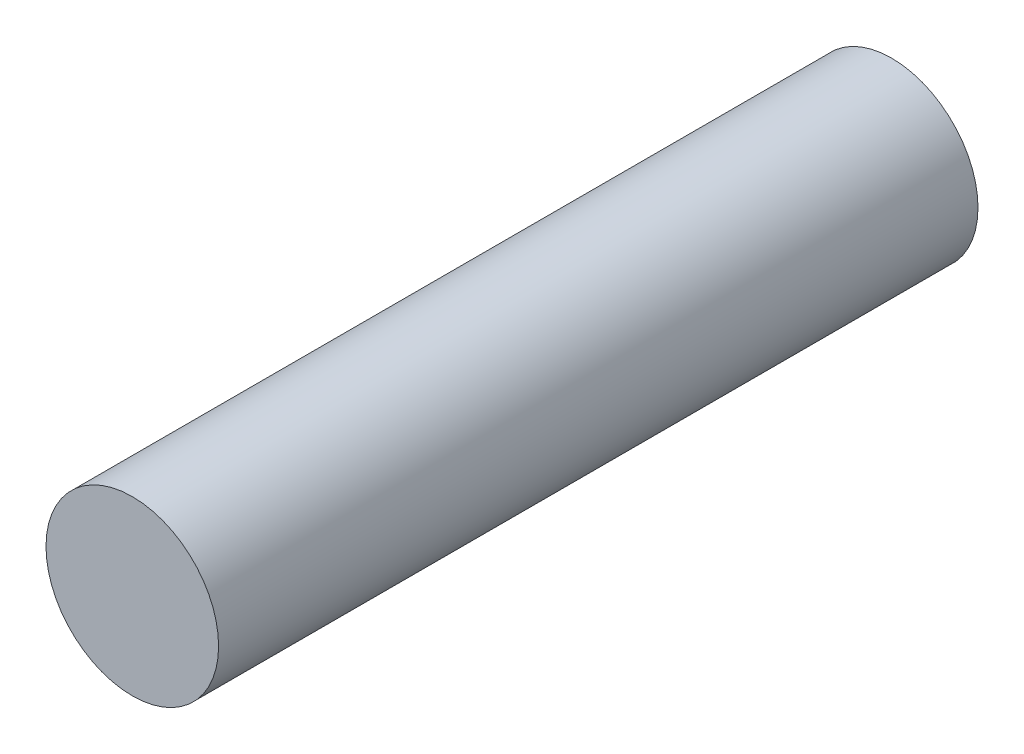
ISO-10303-21;
HEADER;
FILE_DESCRIPTION(('STEP AP214'),'2;1');
FILE_NAME('part.step','',(''),(''),'','','');
FILE_SCHEMA(('AUTOMOTIVE_DESIGN { 1 0 10303 214 1 1 1 1 }'));
ENDSEC;
DATA;
#1=APPLICATION_CONTEXT('core data for automotive mechanical design processes');
#2=APPLICATION_PROTOCOL_DEFINITION('international standard','automotive_design',2000,#1);
#3=PRODUCT_CONTEXT('',#1,'mechanical');
#4=PRODUCT('Part','Part','',(#3));
#5=PRODUCT_RELATED_PRODUCT_CATEGORY('part','',(#4));
#6=PRODUCT_DEFINITION_FORMATION('','',#4);
#7=PRODUCT_DEFINITION_CONTEXT('part definition',#1,'design');
#8=PRODUCT_DEFINITION('design','',#6,#7);
#9=PRODUCT_DEFINITION_SHAPE('','',#8);
#10=(LENGTH_UNIT() NAMED_UNIT(*) SI_UNIT(.MILLI.,.METRE.));
#11=(NAMED_UNIT(*) PLANE_ANGLE_UNIT() SI_UNIT($,.RADIAN.));
#12=(NAMED_UNIT(*) SI_UNIT($,.STERADIAN.) SOLID_ANGLE_UNIT());
#13=UNCERTAINTY_MEASURE_WITH_UNIT(LENGTH_MEASURE(1.E-05),#10,'distance_accuracy_value','');
#14=(GEOMETRIC_REPRESENTATION_CONTEXT(3) GLOBAL_UNCERTAINTY_ASSIGNED_CONTEXT((#13)) GLOBAL_UNIT_ASSIGNED_CONTEXT((#10,
#11,#12)) REPRESENTATION_CONTEXT('',''));
#15=CARTESIAN_POINT('',(0.,0.,0.));
#16=DIRECTION('',(0.,0.,1.));
#17=DIRECTION('',(1.,0.,0.));
#18=AXIS2_PLACEMENT_3D('',#15,#16,#17);
#19=CARTESIAN_POINT('',(0.,0.,22.));
#20=DIRECTION('',(0.,0.,-1.));
#21=DIRECTION('',(-1.,0.,0.));
#22=AXIS2_PLACEMENT_3D('',#19,#20,#21);
#23=CYLINDRICAL_SURFACE('',#22,2.5);
#24=CARTESIAN_POINT('',(0.,0.,22.));
#25=DIRECTION('',(0.,0.,1.));
#26=DIRECTION('',(1.,0.,0.));
#27=AXIS2_PLACEMENT_3D('',#24,#25,#26);
#28=CIRCLE('',#27,2.5);
#29=CARTESIAN_POINT('',(2.5,0.,22.));
#30=VERTEX_POINT('',#29);
#31=EDGE_CURVE('E10',#30,#30,#28,.T.);
#32=ORIENTED_EDGE('',*,*,#31,.F.);
#33=EDGE_LOOP('',(#32));
#34=FACE_BOUND('',#33,.T.);
#35=CARTESIAN_POINT('',(0.,0.,0.));
#36=DIRECTION('',(0.,0.,1.));
#37=DIRECTION('',(1.,0.,0.));
#38=AXIS2_PLACEMENT_3D('',#35,#36,#37);
#39=CIRCLE('',#38,2.5);
#40=CARTESIAN_POINT('',(2.5,0.,0.));
#41=VERTEX_POINT('',#40);
#42=EDGE_CURVE('E38',#41,#41,#39,.T.);
#43=ORIENTED_EDGE('',*,*,#42,.T.);
#44=EDGE_LOOP('',(#43));
#45=FACE_BOUND('',#44,.T.);
#46=ADVANCED_FACE('F35',(#34,#45),#23,.T.);
#47=CARTESIAN_POINT('',(0.,0.,22.));
#48=DIRECTION('',(0.,0.,1.));
#49=DIRECTION('',(1.,0.,0.));
#50=AXIS2_PLACEMENT_3D('',#47,#48,#49);
#51=PLANE('',#50);
#52=ORIENTED_EDGE('',*,*,#31,.T.);
#53=EDGE_LOOP('',(#52));
#54=FACE_BOUND('',#53,.T.);
#55=ADVANCED_FACE('F52',(#54),#51,.T.);
#56=CARTESIAN_POINT('',(0.,0.,0.));
#57=DIRECTION('',(0.,0.,1.));
#58=DIRECTION('',(1.,0.,0.));
#59=AXIS2_PLACEMENT_3D('',#56,#57,#58);
#60=PLANE('',#59);
#61=ORIENTED_EDGE('',*,*,#42,.F.);
#62=EDGE_LOOP('',(#61));
#63=FACE_BOUND('',#62,.T.);
#64=ADVANCED_FACE('F50',(#63),#60,.F.);
#65=CLOSED_SHELL('',(#46,#55,#64));
#66=MANIFOLD_SOLID_BREP('B2',#65);
#67=ADVANCED_BREP_SHAPE_REPRESENTATION('',(#18,#66),#14);
#68=SHAPE_DEFINITION_REPRESENTATION(#9,#67);
ENDSEC;
END-ISO-10303-21;
